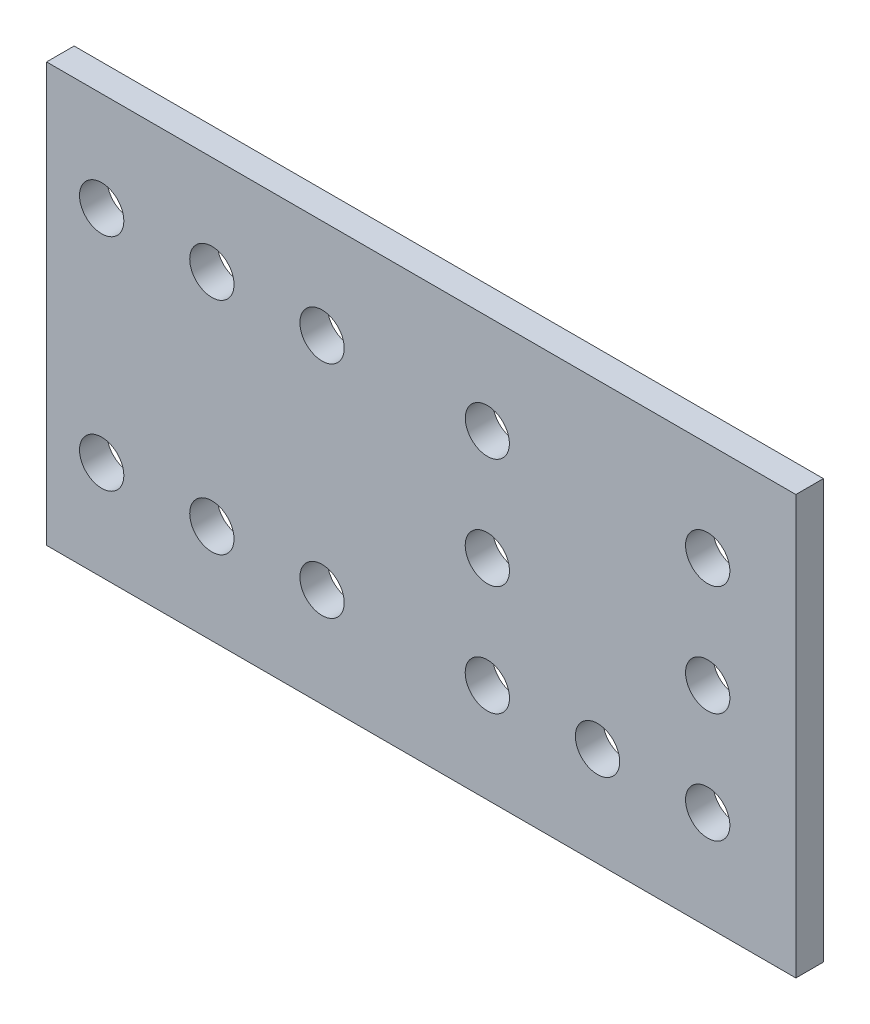
ISO-10303-21;
HEADER;
FILE_DESCRIPTION(('STEP AP214'),'2;1');
FILE_NAME('part.step','',(''),(''),'','','');
FILE_SCHEMA(('AUTOMOTIVE_DESIGN { 1 0 10303 214 1 1 1 1 }'));
ENDSEC;
DATA;
#1=APPLICATION_CONTEXT('core data for automotive mechanical design processes');
#2=APPLICATION_PROTOCOL_DEFINITION('international standard','automotive_design',2000,#1);
#3=PRODUCT_CONTEXT('',#1,'mechanical');
#4=PRODUCT('Part','Part','',(#3));
#5=PRODUCT_RELATED_PRODUCT_CATEGORY('part','',(#4));
#6=PRODUCT_DEFINITION_FORMATION('','',#4);
#7=PRODUCT_DEFINITION_CONTEXT('part definition',#1,'design');
#8=PRODUCT_DEFINITION('design','',#6,#7);
#9=PRODUCT_DEFINITION_SHAPE('','',#8);
#10=(LENGTH_UNIT() NAMED_UNIT(*) SI_UNIT(.MILLI.,.METRE.));
#11=(NAMED_UNIT(*) PLANE_ANGLE_UNIT() SI_UNIT($,.RADIAN.));
#12=(NAMED_UNIT(*) SI_UNIT($,.STERADIAN.) SOLID_ANGLE_UNIT());
#13=UNCERTAINTY_MEASURE_WITH_UNIT(LENGTH_MEASURE(1.E-05),#10,'distance_accuracy_value','');
#14=(GEOMETRIC_REPRESENTATION_CONTEXT(3) GLOBAL_UNCERTAINTY_ASSIGNED_CONTEXT((#13)) GLOBAL_UNIT_ASSIGNED_CONTEXT((#10,
#11,#12)) REPRESENTATION_CONTEXT('',''));
#15=CARTESIAN_POINT('',(0.,0.,0.));
#16=DIRECTION('',(0.,0.,1.));
#17=DIRECTION('',(1.,0.,0.));
#18=AXIS2_PLACEMENT_3D('',#15,#16,#17);
#19=CARTESIAN_POINT('',(0.,0.,3.175));
#20=DIRECTION('',(1.,0.,0.));
#21=DIRECTION('',(0.,0.,-1.));
#22=AXIS2_PLACEMENT_3D('',#19,#20,#21);
#23=PLANE('',#22);
#24=DIRECTION('',(0.,-1.,0.));
#25=VECTOR('',#24,1.);
#26=CARTESIAN_POINT('',(0.,0.,0.));
#27=LINE('',#26,#25);
#28=CARTESIAN_POINT('',(0.,48.26,0.));
#29=VERTEX_POINT('',#28);
#30=CARTESIAN_POINT('',(0.,0.,0.));
#31=VERTEX_POINT('',#30);
#32=EDGE_CURVE('E95',#29,#31,#27,.T.);
#33=ORIENTED_EDGE('',*,*,#32,.T.);
#34=DIRECTION('',(0.,0.,-1.));
#35=VECTOR('',#34,1.);
#36=CARTESIAN_POINT('',(0.,0.,3.175));
#37=LINE('',#36,#35);
#38=CARTESIAN_POINT('',(0.,0.,3.175));
#39=VERTEX_POINT('',#38);
#40=EDGE_CURVE('E11',#39,#31,#37,.T.);
#41=ORIENTED_EDGE('',*,*,#40,.F.);
#42=DIRECTION('',(0.,-1.,0.));
#43=VECTOR('',#42,1.);
#44=CARTESIAN_POINT('',(0.,0.,3.175));
#45=LINE('',#44,#43);
#46=CARTESIAN_POINT('',(0.,48.26,3.175));
#47=VERTEX_POINT('',#46);
#48=EDGE_CURVE('E83',#47,#39,#45,.T.);
#49=ORIENTED_EDGE('',*,*,#48,.F.);
#50=DIRECTION('',(0.,0.,-1.));
#51=VECTOR('',#50,1.);
#52=CARTESIAN_POINT('',(0.,48.26,3.175));
#53=LINE('',#52,#51);
#54=EDGE_CURVE('E91',#47,#29,#53,.T.);
#55=ORIENTED_EDGE('',*,*,#54,.T.);
#56=EDGE_LOOP('',(#33,#41,#49,#55));
#57=FACE_BOUND('',#56,.T.);
#58=ADVANCED_FACE('F32',(#57),#23,.F.);
#59=CARTESIAN_POINT('',(0.,0.,3.175));
#60=DIRECTION('',(0.,1.,0.));
#61=DIRECTION('',(0.,0.,1.));
#62=AXIS2_PLACEMENT_3D('',#59,#60,#61);
#63=PLANE('',#62);
#64=DIRECTION('',(1.,0.,0.));
#65=VECTOR('',#64,1.);
#66=CARTESIAN_POINT('',(0.,0.,0.));
#67=LINE('',#66,#65);
#68=CARTESIAN_POINT('',(86.36,0.,0.));
#69=VERTEX_POINT('',#68);
#70=EDGE_CURVE('E87',#31,#69,#67,.T.);
#71=ORIENTED_EDGE('',*,*,#70,.T.);
#72=DIRECTION('',(0.,0.,-1.));
#73=VECTOR('',#72,1.);
#74=CARTESIAN_POINT('',(86.36,0.,3.175));
#75=LINE('',#74,#73);
#76=CARTESIAN_POINT('',(86.36,0.,3.175));
#77=VERTEX_POINT('',#76);
#78=EDGE_CURVE('E40',#77,#69,#75,.T.);
#79=ORIENTED_EDGE('',*,*,#78,.F.);
#80=DIRECTION('',(1.,0.,0.));
#81=VECTOR('',#80,1.);
#82=CARTESIAN_POINT('',(0.,0.,3.175));
#83=LINE('',#82,#81);
#84=EDGE_CURVE('E78',#39,#77,#83,.T.);
#85=ORIENTED_EDGE('',*,*,#84,.F.);
#86=ORIENTED_EDGE('',*,*,#40,.T.);
#87=EDGE_LOOP('',(#71,#79,#85,#86));
#88=FACE_BOUND('',#87,.T.);
#89=ADVANCED_FACE('F86',(#88),#63,.F.);
#90=CARTESIAN_POINT('',(86.36,0.,3.175));
#91=DIRECTION('',(-1.,0.,0.));
#92=DIRECTION('',(0.,0.,1.));
#93=AXIS2_PLACEMENT_3D('',#90,#91,#92);
#94=PLANE('',#93);
#95=DIRECTION('',(0.,1.,0.));
#96=VECTOR('',#95,1.);
#97=CARTESIAN_POINT('',(86.36,0.,0.));
#98=LINE('',#97,#96);
#99=CARTESIAN_POINT('',(86.36,48.26,0.));
#100=VERTEX_POINT('',#99);
#101=EDGE_CURVE('E65',#69,#100,#98,.T.);
#102=ORIENTED_EDGE('',*,*,#101,.T.);
#103=DIRECTION('',(0.,0.,-1.));
#104=VECTOR('',#103,1.);
#105=CARTESIAN_POINT('',(86.36,48.26,3.175));
#106=LINE('',#105,#104);
#107=CARTESIAN_POINT('',(86.36,48.26,3.175));
#108=VERTEX_POINT('',#107);
#109=EDGE_CURVE('E88',#108,#100,#106,.T.);
#110=ORIENTED_EDGE('',*,*,#109,.F.);
#111=DIRECTION('',(0.,1.,0.));
#112=VECTOR('',#111,1.);
#113=CARTESIAN_POINT('',(86.36,0.,3.175));
#114=LINE('',#113,#112);
#115=EDGE_CURVE('E81',#77,#108,#114,.T.);
#116=ORIENTED_EDGE('',*,*,#115,.F.);
#117=ORIENTED_EDGE('',*,*,#78,.T.);
#118=EDGE_LOOP('',(#102,#110,#116,#117));
#119=FACE_BOUND('',#118,.T.);
#120=ADVANCED_FACE('F89',(#119),#94,.F.);
#121=CARTESIAN_POINT('',(0.,48.26,3.175));
#122=DIRECTION('',(0.,-1.,0.));
#123=DIRECTION('',(0.,0.,-1.));
#124=AXIS2_PLACEMENT_3D('',#121,#122,#123);
#125=PLANE('',#124);
#126=DIRECTION('',(-1.,0.,0.));
#127=VECTOR('',#126,1.);
#128=CARTESIAN_POINT('',(0.,48.26,0.));
#129=LINE('',#128,#127);
#130=EDGE_CURVE('E71',#100,#29,#129,.T.);
#131=ORIENTED_EDGE('',*,*,#130,.T.);
#132=ORIENTED_EDGE('',*,*,#54,.F.);
#133=DIRECTION('',(-1.,0.,0.));
#134=VECTOR('',#133,1.);
#135=CARTESIAN_POINT('',(0.,48.26,3.175));
#136=LINE('',#135,#134);
#137=EDGE_CURVE('E48',#108,#47,#136,.T.);
#138=ORIENTED_EDGE('',*,*,#137,.F.);
#139=ORIENTED_EDGE('',*,*,#109,.T.);
#140=EDGE_LOOP('',(#131,#132,#138,#139));
#141=FACE_BOUND('',#140,.T.);
#142=ADVANCED_FACE('F103',(#141),#125,.F.);
#143=CARTESIAN_POINT('',(0.,0.,3.175));
#144=DIRECTION('',(0.,0.,-1.));
#145=DIRECTION('',(-1.,0.,0.));
#146=AXIS2_PLACEMENT_3D('',#143,#144,#145);
#147=PLANE('',#146);
#148=CARTESIAN_POINT('',(76.2,11.4299999999999,3.175));
#149=DIRECTION('',(0.,0.,-1.));
#150=DIRECTION('',(-1.,0.,0.));
#151=AXIS2_PLACEMENT_3D('',#148,#149,#150);
#152=CIRCLE('',#151,2.55270000000001);
#153=CARTESIAN_POINT('',(73.6473,11.4299999999999,3.175));
#154=VERTEX_POINT('',#153);
#155=EDGE_CURVE('E155',#154,#154,#152,.T.);
#156=ORIENTED_EDGE('',*,*,#155,.T.);
#157=EDGE_LOOP('',(#156));
#158=FACE_BOUND('',#157,.T.);
#159=CARTESIAN_POINT('',(63.5,11.4299999999999,3.175));
#160=DIRECTION('',(0.,0.,-1.));
#161=DIRECTION('',(-1.,0.,0.));
#162=AXIS2_PLACEMENT_3D('',#159,#160,#161);
#163=CIRCLE('',#162,2.55270000000001);
#164=CARTESIAN_POINT('',(60.9473,11.4299999999999,3.175));
#165=VERTEX_POINT('',#164);
#166=EDGE_CURVE('E178',#165,#165,#163,.T.);
#167=ORIENTED_EDGE('',*,*,#166,.T.);
#168=EDGE_LOOP('',(#167));
#169=FACE_BOUND('',#168,.T.);
#170=CARTESIAN_POINT('',(50.8,11.4299999999999,3.175));
#171=DIRECTION('',(0.,0.,-1.));
#172=DIRECTION('',(-1.,0.,0.));
#173=AXIS2_PLACEMENT_3D('',#170,#171,#172);
#174=CIRCLE('',#173,2.55270000000001);
#175=CARTESIAN_POINT('',(48.2473,11.4299999999999,3.175));
#176=VERTEX_POINT('',#175);
#177=EDGE_CURVE('E172',#176,#176,#174,.T.);
#178=ORIENTED_EDGE('',*,*,#177,.T.);
#179=EDGE_LOOP('',(#178));
#180=FACE_BOUND('',#179,.T.);
#181=CARTESIAN_POINT('',(50.8,36.8299999999999,3.175));
#182=DIRECTION('',(0.,0.,-1.));
#183=DIRECTION('',(-1.,0.,0.));
#184=AXIS2_PLACEMENT_3D('',#181,#182,#183);
#185=CIRCLE('',#184,2.53999999999999);
#186=CARTESIAN_POINT('',(48.2600000000001,36.8299999999999,3.175));
#187=VERTEX_POINT('',#186);
#188=EDGE_CURVE('E154',#187,#187,#185,.T.);
#189=ORIENTED_EDGE('',*,*,#188,.T.);
#190=EDGE_LOOP('',(#189));
#191=FACE_BOUND('',#190,.T.);
#192=CARTESIAN_POINT('',(50.8000000000003,24.1300000000006,3.175));
#193=DIRECTION('',(0.,0.,-1.));
#194=DIRECTION('',(-1.,0.,0.));
#195=AXIS2_PLACEMENT_3D('',#192,#193,#194);
#196=CIRCLE('',#195,2.5527);
#197=CARTESIAN_POINT('',(48.2473000000003,24.1300000000006,3.175));
#198=VERTEX_POINT('',#197);
#199=EDGE_CURVE('E161',#198,#198,#196,.T.);
#200=ORIENTED_EDGE('',*,*,#199,.T.);
#201=EDGE_LOOP('',(#200));
#202=FACE_BOUND('',#201,.T.);
#203=CARTESIAN_POINT('',(76.2000000000003,24.1300000000006,3.175));
#204=DIRECTION('',(0.,0.,-1.));
#205=DIRECTION('',(-1.,0.,0.));
#206=AXIS2_PLACEMENT_3D('',#203,#204,#205);
#207=CIRCLE('',#206,2.55270000000001);
#208=CARTESIAN_POINT('',(73.6473000000003,24.1300000000006,3.175));
#209=VERTEX_POINT('',#208);
#210=EDGE_CURVE('E148',#209,#209,#207,.T.);
#211=ORIENTED_EDGE('',*,*,#210,.T.);
#212=EDGE_LOOP('',(#211));
#213=FACE_BOUND('',#212,.T.);
#214=CARTESIAN_POINT('',(76.2,36.8299999999999,3.175));
#215=DIRECTION('',(0.,0.,-1.));
#216=DIRECTION('',(-1.,0.,0.));
#217=AXIS2_PLACEMENT_3D('',#214,#215,#216);
#218=CIRCLE('',#217,2.55270000000001);
#219=CARTESIAN_POINT('',(73.6473,36.8299999999999,3.175));
#220=VERTEX_POINT('',#219);
#221=EDGE_CURVE('E144',#220,#220,#218,.T.);
#222=ORIENTED_EDGE('',*,*,#221,.T.);
#223=EDGE_LOOP('',(#222));
#224=FACE_BOUND('',#223,.T.);
#225=CARTESIAN_POINT('',(31.75,36.83,3.175));
#226=DIRECTION('',(0.,0.,-1.));
#227=DIRECTION('',(-1.,0.,0.));
#228=AXIS2_PLACEMENT_3D('',#225,#226,#227);
#229=CIRCLE('',#228,2.5527);
#230=CARTESIAN_POINT('',(29.1973,36.83,3.175));
#231=VERTEX_POINT('',#230);
#232=EDGE_CURVE('E98',#231,#231,#229,.T.);
#233=ORIENTED_EDGE('',*,*,#232,.T.);
#234=EDGE_LOOP('',(#233));
#235=FACE_BOUND('',#234,.T.);
#236=CARTESIAN_POINT('',(19.05,11.43,3.175));
#237=DIRECTION('',(0.,0.,-1.));
#238=DIRECTION('',(-1.,0.,0.));
#239=AXIS2_PLACEMENT_3D('',#236,#237,#238);
#240=CIRCLE('',#239,2.5527);
#241=CARTESIAN_POINT('',(16.4973,11.43,3.175));
#242=VERTEX_POINT('',#241);
#243=EDGE_CURVE('E111',#242,#242,#240,.T.);
#244=ORIENTED_EDGE('',*,*,#243,.T.);
#245=EDGE_LOOP('',(#244));
#246=FACE_BOUND('',#245,.T.);
#247=CARTESIAN_POINT('',(19.05,36.83,3.175));
#248=DIRECTION('',(0.,0.,-1.));
#249=DIRECTION('',(-1.,0.,0.));
#250=AXIS2_PLACEMENT_3D('',#247,#248,#249);
#251=CIRCLE('',#250,2.5527);
#252=CARTESIAN_POINT('',(16.4973,36.83,3.175));
#253=VERTEX_POINT('',#252);
#254=EDGE_CURVE('E114',#253,#253,#251,.T.);
#255=ORIENTED_EDGE('',*,*,#254,.T.);
#256=EDGE_LOOP('',(#255));
#257=FACE_BOUND('',#256,.T.);
#258=CARTESIAN_POINT('',(6.35,11.43,3.175));
#259=DIRECTION('',(0.,0.,-1.));
#260=DIRECTION('',(-1.,0.,0.));
#261=AXIS2_PLACEMENT_3D('',#258,#259,#260);
#262=CIRCLE('',#261,2.5527);
#263=CARTESIAN_POINT('',(3.7973,11.43,3.175));
#264=VERTEX_POINT('',#263);
#265=EDGE_CURVE('E117',#264,#264,#262,.T.);
#266=ORIENTED_EDGE('',*,*,#265,.T.);
#267=EDGE_LOOP('',(#266));
#268=FACE_BOUND('',#267,.T.);
#269=CARTESIAN_POINT('',(31.75,11.43,3.175));
#270=DIRECTION('',(0.,0.,-1.));
#271=DIRECTION('',(-1.,0.,0.));
#272=AXIS2_PLACEMENT_3D('',#269,#270,#271);
#273=CIRCLE('',#272,2.5527);
#274=CARTESIAN_POINT('',(29.1973,11.43,3.175));
#275=VERTEX_POINT('',#274);
#276=EDGE_CURVE('E120',#275,#275,#273,.T.);
#277=ORIENTED_EDGE('',*,*,#276,.T.);
#278=EDGE_LOOP('',(#277));
#279=FACE_BOUND('',#278,.T.);
#280=CARTESIAN_POINT('',(6.35,36.83,3.175));
#281=DIRECTION('',(0.,0.,-1.));
#282=DIRECTION('',(-1.,0.,0.));
#283=AXIS2_PLACEMENT_3D('',#280,#281,#282);
#284=CIRCLE('',#283,2.5527);
#285=CARTESIAN_POINT('',(3.7973,36.83,3.175));
#286=VERTEX_POINT('',#285);
#287=EDGE_CURVE('E123',#286,#286,#284,.T.);
#288=ORIENTED_EDGE('',*,*,#287,.T.);
#289=EDGE_LOOP('',(#288));
#290=FACE_BOUND('',#289,.T.);
#291=ORIENTED_EDGE('',*,*,#48,.T.);
#292=ORIENTED_EDGE('',*,*,#84,.T.);
#293=ORIENTED_EDGE('',*,*,#115,.T.);
#294=ORIENTED_EDGE('',*,*,#137,.T.);
#295=EDGE_LOOP('',(#291,#292,#293,#294));
#296=FACE_BOUND('',#295,.T.);
#297=ADVANCED_FACE('F79',(#158,#169,#180,#191,#202,#213,#224,#235,#246,#257,#268,#279,#290,
#296),#147,.F.);
#298=CARTESIAN_POINT('',(0.,0.,0.));
#299=DIRECTION('',(0.,0.,-1.));
#300=DIRECTION('',(-1.,0.,0.));
#301=AXIS2_PLACEMENT_3D('',#298,#299,#300);
#302=PLANE('',#301);
#303=CARTESIAN_POINT('',(76.2,11.4299999999999,0.));
#304=DIRECTION('',(0.,0.,-1.));
#305=DIRECTION('',(-1.,0.,0.));
#306=AXIS2_PLACEMENT_3D('',#303,#304,#305);
#307=CIRCLE('',#306,2.55270000000001);
#308=CARTESIAN_POINT('',(73.6473,11.4299999999999,0.));
#309=VERTEX_POINT('',#308);
#310=EDGE_CURVE('E181',#309,#309,#307,.T.);
#311=ORIENTED_EDGE('',*,*,#310,.F.);
#312=EDGE_LOOP('',(#311));
#313=FACE_BOUND('',#312,.T.);
#314=CARTESIAN_POINT('',(63.5,11.4299999999999,0.));
#315=DIRECTION('',(0.,0.,-1.));
#316=DIRECTION('',(-1.,0.,0.));
#317=AXIS2_PLACEMENT_3D('',#314,#315,#316);
#318=CIRCLE('',#317,2.55270000000001);
#319=CARTESIAN_POINT('',(60.9473,11.4299999999999,0.));
#320=VERTEX_POINT('',#319);
#321=EDGE_CURVE('E175',#320,#320,#318,.T.);
#322=ORIENTED_EDGE('',*,*,#321,.F.);
#323=EDGE_LOOP('',(#322));
#324=FACE_BOUND('',#323,.T.);
#325=CARTESIAN_POINT('',(50.8,11.4299999999999,0.));
#326=DIRECTION('',(0.,0.,-1.));
#327=DIRECTION('',(-1.,0.,0.));
#328=AXIS2_PLACEMENT_3D('',#325,#326,#327);
#329=CIRCLE('',#328,2.55270000000001);
#330=CARTESIAN_POINT('',(48.2473,11.4299999999999,0.));
#331=VERTEX_POINT('',#330);
#332=EDGE_CURVE('E169',#331,#331,#329,.T.);
#333=ORIENTED_EDGE('',*,*,#332,.F.);
#334=EDGE_LOOP('',(#333));
#335=FACE_BOUND('',#334,.T.);
#336=CARTESIAN_POINT('',(50.8,36.8299999999999,0.));
#337=DIRECTION('',(0.,0.,-1.));
#338=DIRECTION('',(-1.,0.,0.));
#339=AXIS2_PLACEMENT_3D('',#336,#337,#338);
#340=CIRCLE('',#339,2.53999999999999);
#341=CARTESIAN_POINT('',(48.2600000000001,36.8299999999999,0.));
#342=VERTEX_POINT('',#341);
#343=EDGE_CURVE('E151',#342,#342,#340,.T.);
#344=ORIENTED_EDGE('',*,*,#343,.F.);
#345=EDGE_LOOP('',(#344));
#346=FACE_BOUND('',#345,.T.);
#347=CARTESIAN_POINT('',(50.8000000000003,24.1300000000006,0.));
#348=DIRECTION('',(0.,0.,-1.));
#349=DIRECTION('',(-1.,0.,0.));
#350=AXIS2_PLACEMENT_3D('',#347,#348,#349);
#351=CIRCLE('',#350,2.5527);
#352=CARTESIAN_POINT('',(48.2473000000003,24.1300000000006,0.));
#353=VERTEX_POINT('',#352);
#354=EDGE_CURVE('E158',#353,#353,#351,.T.);
#355=ORIENTED_EDGE('',*,*,#354,.F.);
#356=EDGE_LOOP('',(#355));
#357=FACE_BOUND('',#356,.T.);
#358=CARTESIAN_POINT('',(76.2000000000003,24.1300000000006,0.));
#359=DIRECTION('',(0.,0.,-1.));
#360=DIRECTION('',(-1.,0.,0.));
#361=AXIS2_PLACEMENT_3D('',#358,#359,#360);
#362=CIRCLE('',#361,2.55270000000001);
#363=CARTESIAN_POINT('',(73.6473000000003,24.1300000000006,0.));
#364=VERTEX_POINT('',#363);
#365=EDGE_CURVE('E164',#364,#364,#362,.T.);
#366=ORIENTED_EDGE('',*,*,#365,.F.);
#367=EDGE_LOOP('',(#366));
#368=FACE_BOUND('',#367,.T.);
#369=CARTESIAN_POINT('',(76.2,36.8299999999999,0.));
#370=DIRECTION('',(0.,0.,-1.));
#371=DIRECTION('',(-1.,0.,0.));
#372=AXIS2_PLACEMENT_3D('',#369,#370,#371);
#373=CIRCLE('',#372,2.55270000000001);
#374=CARTESIAN_POINT('',(73.6473,36.8299999999999,0.));
#375=VERTEX_POINT('',#374);
#376=EDGE_CURVE('E145',#375,#375,#373,.T.);
#377=ORIENTED_EDGE('',*,*,#376,.F.);
#378=EDGE_LOOP('',(#377));
#379=FACE_BOUND('',#378,.T.);
#380=CARTESIAN_POINT('',(31.75,36.83,0.));
#381=DIRECTION('',(0.,0.,1.));
#382=DIRECTION('',(1.,0.,0.));
#383=AXIS2_PLACEMENT_3D('',#380,#381,#382);
#384=CIRCLE('',#383,2.5527);
#385=CARTESIAN_POINT('',(34.3027,36.83,0.));
#386=VERTEX_POINT('',#385);
#387=EDGE_CURVE('E136',#386,#386,#384,.T.);
#388=ORIENTED_EDGE('',*,*,#387,.T.);
#389=EDGE_LOOP('',(#388));
#390=FACE_BOUND('',#389,.T.);
#391=CARTESIAN_POINT('',(19.05,11.43,0.));
#392=DIRECTION('',(0.,0.,1.));
#393=DIRECTION('',(1.,0.,0.));
#394=AXIS2_PLACEMENT_3D('',#391,#392,#393);
#395=CIRCLE('',#394,2.5527);
#396=CARTESIAN_POINT('',(21.6027,11.43,0.));
#397=VERTEX_POINT('',#396);
#398=EDGE_CURVE('E133',#397,#397,#395,.T.);
#399=ORIENTED_EDGE('',*,*,#398,.T.);
#400=EDGE_LOOP('',(#399));
#401=FACE_BOUND('',#400,.T.);
#402=CARTESIAN_POINT('',(19.05,36.83,0.));
#403=DIRECTION('',(0.,0.,1.));
#404=DIRECTION('',(1.,0.,0.));
#405=AXIS2_PLACEMENT_3D('',#402,#403,#404);
#406=CIRCLE('',#405,2.5527);
#407=CARTESIAN_POINT('',(21.6027,36.83,0.));
#408=VERTEX_POINT('',#407);
#409=EDGE_CURVE('E130',#408,#408,#406,.T.);
#410=ORIENTED_EDGE('',*,*,#409,.T.);
#411=EDGE_LOOP('',(#410));
#412=FACE_BOUND('',#411,.T.);
#413=CARTESIAN_POINT('',(6.35,11.43,0.));
#414=DIRECTION('',(0.,0.,1.));
#415=DIRECTION('',(1.,0.,0.));
#416=AXIS2_PLACEMENT_3D('',#413,#414,#415);
#417=CIRCLE('',#416,2.5527);
#418=CARTESIAN_POINT('',(8.9027,11.43,0.));
#419=VERTEX_POINT('',#418);
#420=EDGE_CURVE('E129',#419,#419,#417,.T.);
#421=ORIENTED_EDGE('',*,*,#420,.T.);
#422=EDGE_LOOP('',(#421));
#423=FACE_BOUND('',#422,.T.);
#424=CARTESIAN_POINT('',(31.75,11.43,0.));
#425=DIRECTION('',(0.,0.,1.));
#426=DIRECTION('',(1.,0.,0.));
#427=AXIS2_PLACEMENT_3D('',#424,#425,#426);
#428=CIRCLE('',#427,2.5527);
#429=CARTESIAN_POINT('',(34.3027,11.43,0.));
#430=VERTEX_POINT('',#429);
#431=EDGE_CURVE('E139',#430,#430,#428,.T.);
#432=ORIENTED_EDGE('',*,*,#431,.T.);
#433=EDGE_LOOP('',(#432));
#434=FACE_BOUND('',#433,.T.);
#435=CARTESIAN_POINT('',(6.35,36.83,0.));
#436=DIRECTION('',(0.,0.,1.));
#437=DIRECTION('',(1.,0.,0.));
#438=AXIS2_PLACEMENT_3D('',#435,#436,#437);
#439=CIRCLE('',#438,2.5527);
#440=CARTESIAN_POINT('',(8.9027,36.83,0.));
#441=VERTEX_POINT('',#440);
#442=EDGE_CURVE('E126',#441,#441,#439,.T.);
#443=ORIENTED_EDGE('',*,*,#442,.T.);
#444=EDGE_LOOP('',(#443));
#445=FACE_BOUND('',#444,.T.);
#446=ORIENTED_EDGE('',*,*,#32,.F.);
#447=ORIENTED_EDGE('',*,*,#130,.F.);
#448=ORIENTED_EDGE('',*,*,#101,.F.);
#449=ORIENTED_EDGE('',*,*,#70,.F.);
#450=EDGE_LOOP('',(#446,#447,#448,#449));
#451=FACE_BOUND('',#450,.T.);
#452=ADVANCED_FACE('F106',(#313,#324,#335,#346,#357,#368,#379,#390,#401,#412,#423,#434,#445,
#451),#302,.T.);
#453=CARTESIAN_POINT('',(6.35,36.83,0.));
#454=DIRECTION('',(0.,0.,1.));
#455=DIRECTION('',(1.,0.,0.));
#456=AXIS2_PLACEMENT_3D('',#453,#454,#455);
#457=CYLINDRICAL_SURFACE('',#456,2.5527);
#458=ORIENTED_EDGE('',*,*,#442,.F.);
#459=EDGE_LOOP('',(#458));
#460=FACE_BOUND('',#459,.T.);
#461=ORIENTED_EDGE('',*,*,#287,.F.);
#462=EDGE_LOOP('',(#461));
#463=FACE_BOUND('',#462,.T.);
#464=ADVANCED_FACE('F198',(#460,#463),#457,.F.);
#465=CARTESIAN_POINT('',(31.75,11.43,0.));
#466=DIRECTION('',(0.,0.,1.));
#467=DIRECTION('',(1.,0.,0.));
#468=AXIS2_PLACEMENT_3D('',#465,#466,#467);
#469=CYLINDRICAL_SURFACE('',#468,2.5527);
#470=ORIENTED_EDGE('',*,*,#431,.F.);
#471=EDGE_LOOP('',(#470));
#472=FACE_BOUND('',#471,.T.);
#473=ORIENTED_EDGE('',*,*,#276,.F.);
#474=EDGE_LOOP('',(#473));
#475=FACE_BOUND('',#474,.T.);
#476=ADVANCED_FACE('F226',(#472,#475),#469,.F.);
#477=CARTESIAN_POINT('',(6.35,11.43,0.));
#478=DIRECTION('',(0.,0.,1.));
#479=DIRECTION('',(1.,0.,0.));
#480=AXIS2_PLACEMENT_3D('',#477,#478,#479);
#481=CYLINDRICAL_SURFACE('',#480,2.5527);
#482=ORIENTED_EDGE('',*,*,#420,.F.);
#483=EDGE_LOOP('',(#482));
#484=FACE_BOUND('',#483,.T.);
#485=ORIENTED_EDGE('',*,*,#265,.F.);
#486=EDGE_LOOP('',(#485));
#487=FACE_BOUND('',#486,.T.);
#488=ADVANCED_FACE('F267',(#484,#487),#481,.F.);
#489=CARTESIAN_POINT('',(19.05,36.83,0.));
#490=DIRECTION('',(0.,0.,1.));
#491=DIRECTION('',(1.,0.,0.));
#492=AXIS2_PLACEMENT_3D('',#489,#490,#491);
#493=CYLINDRICAL_SURFACE('',#492,2.5527);
#494=ORIENTED_EDGE('',*,*,#409,.F.);
#495=EDGE_LOOP('',(#494));
#496=FACE_BOUND('',#495,.T.);
#497=ORIENTED_EDGE('',*,*,#254,.F.);
#498=EDGE_LOOP('',(#497));
#499=FACE_BOUND('',#498,.T.);
#500=ADVANCED_FACE('F277',(#496,#499),#493,.F.);
#501=CARTESIAN_POINT('',(19.05,11.43,0.));
#502=DIRECTION('',(0.,0.,1.));
#503=DIRECTION('',(1.,0.,0.));
#504=AXIS2_PLACEMENT_3D('',#501,#502,#503);
#505=CYLINDRICAL_SURFACE('',#504,2.5527);
#506=ORIENTED_EDGE('',*,*,#398,.F.);
#507=EDGE_LOOP('',(#506));
#508=FACE_BOUND('',#507,.T.);
#509=ORIENTED_EDGE('',*,*,#243,.F.);
#510=EDGE_LOOP('',(#509));
#511=FACE_BOUND('',#510,.T.);
#512=ADVANCED_FACE('F287',(#508,#511),#505,.F.);
#513=CARTESIAN_POINT('',(31.75,36.83,0.));
#514=DIRECTION('',(0.,0.,1.));
#515=DIRECTION('',(1.,0.,0.));
#516=AXIS2_PLACEMENT_3D('',#513,#514,#515);
#517=CYLINDRICAL_SURFACE('',#516,2.5527);
#518=ORIENTED_EDGE('',*,*,#387,.F.);
#519=EDGE_LOOP('',(#518));
#520=FACE_BOUND('',#519,.T.);
#521=ORIENTED_EDGE('',*,*,#232,.F.);
#522=EDGE_LOOP('',(#521));
#523=FACE_BOUND('',#522,.T.);
#524=ADVANCED_FACE('F297',(#520,#523),#517,.F.);
#525=CARTESIAN_POINT('',(76.2,36.8299999999999,3.175));
#526=DIRECTION('',(0.,0.,-1.));
#527=DIRECTION('',(-1.,0.,0.));
#528=AXIS2_PLACEMENT_3D('',#525,#526,#527);
#529=CYLINDRICAL_SURFACE('',#528,2.55270000000001);
#530=ORIENTED_EDGE('',*,*,#221,.F.);
#531=EDGE_LOOP('',(#530));
#532=FACE_BOUND('',#531,.T.);
#533=ORIENTED_EDGE('',*,*,#376,.T.);
#534=EDGE_LOOP('',(#533));
#535=FACE_BOUND('',#534,.T.);
#536=ADVANCED_FACE('F307',(#532,#535),#529,.F.);
#537=CARTESIAN_POINT('',(76.2000000000003,24.1300000000006,3.175));
#538=DIRECTION('',(0.,0.,-1.));
#539=DIRECTION('',(-1.,0.,0.));
#540=AXIS2_PLACEMENT_3D('',#537,#538,#539);
#541=CYLINDRICAL_SURFACE('',#540,2.55270000000001);
#542=ORIENTED_EDGE('',*,*,#210,.F.);
#543=EDGE_LOOP('',(#542));
#544=FACE_BOUND('',#543,.T.);
#545=ORIENTED_EDGE('',*,*,#365,.T.);
#546=EDGE_LOOP('',(#545));
#547=FACE_BOUND('',#546,.T.);
#548=ADVANCED_FACE('F317',(#544,#547),#541,.F.);
#549=CARTESIAN_POINT('',(50.8000000000003,24.1300000000006,3.175));
#550=DIRECTION('',(0.,0.,-1.));
#551=DIRECTION('',(-1.,0.,0.));
#552=AXIS2_PLACEMENT_3D('',#549,#550,#551);
#553=CYLINDRICAL_SURFACE('',#552,2.5527);
#554=ORIENTED_EDGE('',*,*,#199,.F.);
#555=EDGE_LOOP('',(#554));
#556=FACE_BOUND('',#555,.T.);
#557=ORIENTED_EDGE('',*,*,#354,.T.);
#558=EDGE_LOOP('',(#557));
#559=FACE_BOUND('',#558,.T.);
#560=ADVANCED_FACE('F327',(#556,#559),#553,.F.);
#561=CARTESIAN_POINT('',(50.8,36.8299999999999,3.175));
#562=DIRECTION('',(0.,0.,-1.));
#563=DIRECTION('',(-1.,0.,0.));
#564=AXIS2_PLACEMENT_3D('',#561,#562,#563);
#565=CYLINDRICAL_SURFACE('',#564,2.53999999999999);
#566=ORIENTED_EDGE('',*,*,#188,.F.);
#567=EDGE_LOOP('',(#566));
#568=FACE_BOUND('',#567,.T.);
#569=ORIENTED_EDGE('',*,*,#343,.T.);
#570=EDGE_LOOP('',(#569));
#571=FACE_BOUND('',#570,.T.);
#572=ADVANCED_FACE('F337',(#568,#571),#565,.F.);
#573=CARTESIAN_POINT('',(50.8,11.4299999999999,3.175));
#574=DIRECTION('',(0.,0.,-1.));
#575=DIRECTION('',(-1.,0.,0.));
#576=AXIS2_PLACEMENT_3D('',#573,#574,#575);
#577=CYLINDRICAL_SURFACE('',#576,2.55270000000001);
#578=ORIENTED_EDGE('',*,*,#177,.F.);
#579=EDGE_LOOP('',(#578));
#580=FACE_BOUND('',#579,.T.);
#581=ORIENTED_EDGE('',*,*,#332,.T.);
#582=EDGE_LOOP('',(#581));
#583=FACE_BOUND('',#582,.T.);
#584=ADVANCED_FACE('F346',(#580,#583),#577,.F.);
#585=CARTESIAN_POINT('',(63.5,11.4299999999999,3.175));
#586=DIRECTION('',(0.,0.,-1.));
#587=DIRECTION('',(-1.,0.,0.));
#588=AXIS2_PLACEMENT_3D('',#585,#586,#587);
#589=CYLINDRICAL_SURFACE('',#588,2.55270000000001);
#590=ORIENTED_EDGE('',*,*,#166,.F.);
#591=EDGE_LOOP('',(#590));
#592=FACE_BOUND('',#591,.T.);
#593=ORIENTED_EDGE('',*,*,#321,.T.);
#594=EDGE_LOOP('',(#593));
#595=FACE_BOUND('',#594,.T.);
#596=ADVANCED_FACE('F192',(#592,#595),#589,.F.);
#597=CARTESIAN_POINT('',(76.2,11.4299999999999,3.175));
#598=DIRECTION('',(0.,0.,-1.));
#599=DIRECTION('',(-1.,0.,0.));
#600=AXIS2_PLACEMENT_3D('',#597,#598,#599);
#601=CYLINDRICAL_SURFACE('',#600,2.55270000000001);
#602=ORIENTED_EDGE('',*,*,#155,.F.);
#603=EDGE_LOOP('',(#602));
#604=FACE_BOUND('',#603,.T.);
#605=ORIENTED_EDGE('',*,*,#310,.T.);
#606=EDGE_LOOP('',(#605));
#607=FACE_BOUND('',#606,.T.);
#608=ADVANCED_FACE('F189',(#604,#607),#601,.F.);
#609=CLOSED_SHELL('',(#58,#89,#120,#142,#297,#452,#464,#476,#488,#500,#512,#524,#536,#548,#560,
#572,#584,#596,#608));
#610=MANIFOLD_SOLID_BREP('B2',#609);
#611=ADVANCED_BREP_SHAPE_REPRESENTATION('',(#18,#610),#14);
#612=SHAPE_DEFINITION_REPRESENTATION(#9,#611);
ENDSEC;
END-ISO-10303-21;
